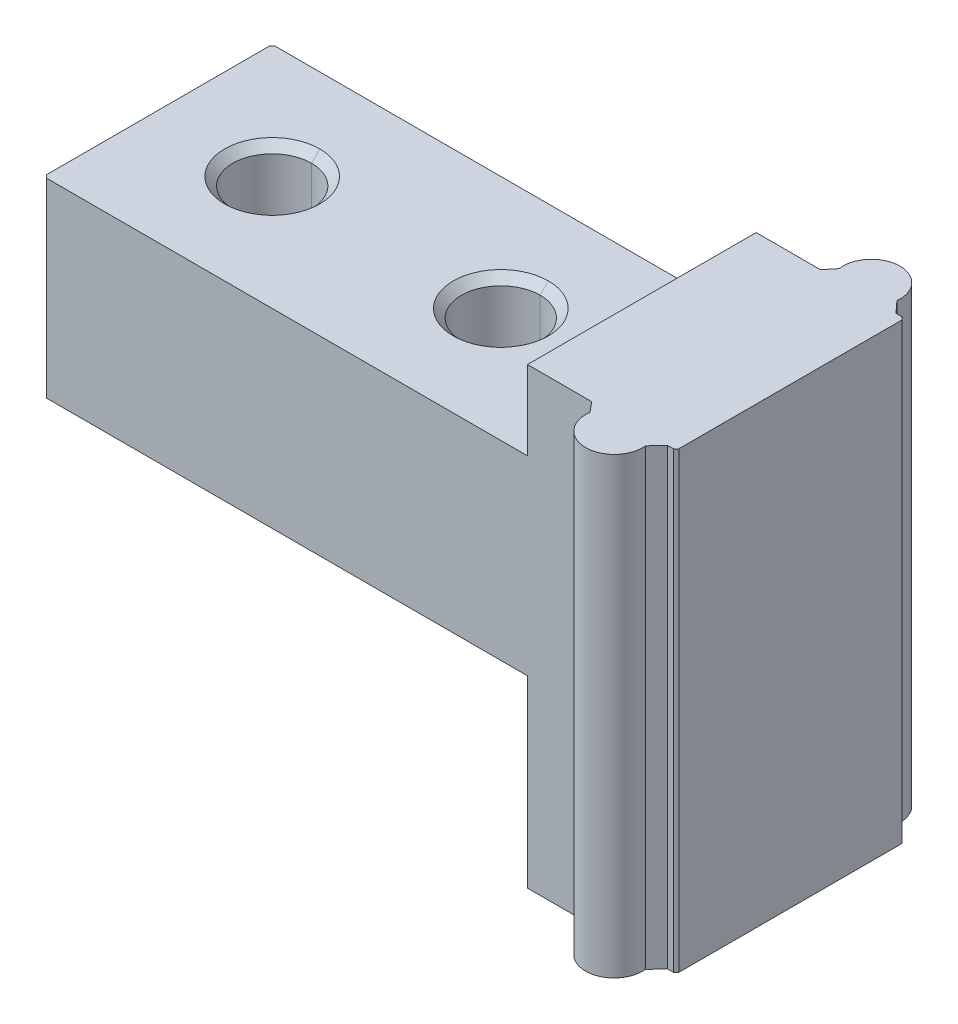
ISO-10303-21;
HEADER;
FILE_DESCRIPTION(('STEP AP214'),'2;1');
FILE_NAME('part.step','',(''),(''),'','','');
FILE_SCHEMA(('AUTOMOTIVE_DESIGN { 1 0 10303 214 1 1 1 1 }'));
ENDSEC;
DATA;
#1=APPLICATION_CONTEXT('core data for automotive mechanical design processes');
#2=APPLICATION_PROTOCOL_DEFINITION('international standard','automotive_design',2000,#1);
#3=PRODUCT_CONTEXT('',#1,'mechanical');
#4=PRODUCT('Part','Part','',(#3));
#5=PRODUCT_RELATED_PRODUCT_CATEGORY('part','',(#4));
#6=PRODUCT_DEFINITION_FORMATION('','',#4);
#7=PRODUCT_DEFINITION_CONTEXT('part definition',#1,'design');
#8=PRODUCT_DEFINITION('design','',#6,#7);
#9=PRODUCT_DEFINITION_SHAPE('','',#8);
#10=(LENGTH_UNIT() NAMED_UNIT(*) SI_UNIT(.MILLI.,.METRE.));
#11=(NAMED_UNIT(*) PLANE_ANGLE_UNIT() SI_UNIT($,.RADIAN.));
#12=(NAMED_UNIT(*) SI_UNIT($,.STERADIAN.) SOLID_ANGLE_UNIT());
#13=UNCERTAINTY_MEASURE_WITH_UNIT(LENGTH_MEASURE(1.E-05),#10,'distance_accuracy_value','');
#14=(GEOMETRIC_REPRESENTATION_CONTEXT(3) GLOBAL_UNCERTAINTY_ASSIGNED_CONTEXT((#13)) GLOBAL_UNIT_ASSIGNED_CONTEXT((#10,
#11,#12)) REPRESENTATION_CONTEXT('',''));
#15=CARTESIAN_POINT('',(0.,0.,0.));
#16=DIRECTION('',(0.,0.,1.));
#17=DIRECTION('',(1.,0.,0.));
#18=AXIS2_PLACEMENT_3D('',#15,#16,#17);
#19=CARTESIAN_POINT('',(-85.,26.217,0.));
#20=DIRECTION('',(0.,1.,0.));
#21=DIRECTION('',(0.,0.,1.));
#22=AXIS2_PLACEMENT_3D('',#19,#20,#21);
#23=CONICAL_SURFACE('',#22,2.067,0.785398163397469);
#24=DIRECTION('',(0.,0.707106781186533,-0.707106781186562));
#25=VECTOR('',#24,1.);
#26=CARTESIAN_POINT('',(-85.,26.217,-2.067));
#27=LINE('',#26,#25);
#28=CARTESIAN_POINT('',(-85.,26.217,-2.067));
#29=VERTEX_POINT('',#28);
#30=CARTESIAN_POINT('',(-85.,26.65,-2.5));
#31=VERTEX_POINT('',#30);
#32=EDGE_CURVE('E784',#29,#31,#27,.T.);
#33=ORIENTED_EDGE('',*,*,#32,.F.);
#34=CARTESIAN_POINT('',(-85.,26.217,0.));
#35=DIRECTION('',(0.,1.,0.));
#36=DIRECTION('',(0.,0.,1.));
#37=AXIS2_PLACEMENT_3D('',#34,#35,#36);
#38=CIRCLE('',#37,2.067);
#39=CARTESIAN_POINT('',(-85.,26.217,2.067));
#40=VERTEX_POINT('',#39);
#41=EDGE_CURVE('E11',#40,#29,#38,.T.);
#42=ORIENTED_EDGE('',*,*,#41,.F.);
#43=DIRECTION('',(0.,0.707106781186533,0.707106781186562));
#44=VECTOR('',#43,1.);
#45=CARTESIAN_POINT('',(-85.,26.217,2.067));
#46=LINE('',#45,#44);
#47=CARTESIAN_POINT('',(-85.,26.65,2.5));
#48=VERTEX_POINT('',#47);
#49=EDGE_CURVE('E793',#40,#48,#46,.T.);
#50=ORIENTED_EDGE('',*,*,#49,.T.);
#51=CARTESIAN_POINT('',(-85.,26.65,0.));
#52=DIRECTION('',(0.,1.,0.));
#53=DIRECTION('',(0.,0.,1.));
#54=AXIS2_PLACEMENT_3D('',#51,#52,#53);
#55=CIRCLE('',#54,2.5);
#56=EDGE_CURVE('E174',#48,#31,#55,.T.);
#57=ORIENTED_EDGE('',*,*,#56,.T.);
#58=EDGE_LOOP('',(#33,#42,#50,#57));
#59=FACE_BOUND('',#58,.T.);
#60=ADVANCED_FACE('F17',(#59),#23,.F.);
#61=CARTESIAN_POINT('',(-85.,26.65,0.));
#62=DIRECTION('',(0.,1.,0.));
#63=DIRECTION('',(0.,0.,1.));
#64=AXIS2_PLACEMENT_3D('',#61,#62,#63);
#65=CYLINDRICAL_SURFACE('',#64,2.067);
#66=DIRECTION('',(0.,1.,0.));
#67=VECTOR('',#66,1.);
#68=CARTESIAN_POINT('',(-85.,26.65,-2.067));
#69=LINE('',#68,#67);
#70=CARTESIAN_POINT('',(-85.,17.073,-2.067));
#71=VERTEX_POINT('',#70);
#72=EDGE_CURVE('E242',#71,#29,#69,.T.);
#73=ORIENTED_EDGE('',*,*,#72,.F.);
#74=CARTESIAN_POINT('',(-85.,17.073,0.));
#75=DIRECTION('',(0.,1.,0.));
#76=DIRECTION('',(0.,0.,1.));
#77=AXIS2_PLACEMENT_3D('',#74,#75,#76);
#78=CIRCLE('',#77,2.067);
#79=CARTESIAN_POINT('',(-85.,17.073,2.067));
#80=VERTEX_POINT('',#79);
#81=EDGE_CURVE('E27',#80,#71,#78,.T.);
#82=ORIENTED_EDGE('',*,*,#81,.F.);
#83=DIRECTION('',(0.,1.,0.));
#84=VECTOR('',#83,1.);
#85=CARTESIAN_POINT('',(-85.,26.65,2.067));
#86=LINE('',#85,#84);
#87=EDGE_CURVE('E237',#80,#40,#86,.T.);
#88=ORIENTED_EDGE('',*,*,#87,.T.);
#89=ORIENTED_EDGE('',*,*,#41,.T.);
#90=EDGE_LOOP('',(#73,#82,#88,#89));
#91=FACE_BOUND('',#90,.T.);
#92=ADVANCED_FACE('F822',(#91),#65,.F.);
#93=CARTESIAN_POINT('',(-85.,16.64,0.));
#94=DIRECTION('',(0.,-1.,0.));
#95=DIRECTION('',(0.,0.,-1.));
#96=AXIS2_PLACEMENT_3D('',#93,#94,#95);
#97=CONICAL_SURFACE('',#96,2.5,0.785398163397469);
#98=DIRECTION('',(0.,-0.707106781186533,0.707106781186562));
#99=VECTOR('',#98,1.);
#100=CARTESIAN_POINT('',(-85.,16.64,2.5));
#101=LINE('',#100,#99);
#102=CARTESIAN_POINT('',(-85.,16.65,2.49));
#103=VERTEX_POINT('',#102);
#104=EDGE_CURVE('E241',#80,#103,#101,.T.);
#105=ORIENTED_EDGE('',*,*,#104,.F.);
#106=ORIENTED_EDGE('',*,*,#81,.T.);
#107=DIRECTION('',(0.,-0.707106781186533,-0.707106781186562));
#108=VECTOR('',#107,1.);
#109=CARTESIAN_POINT('',(-85.,16.64,-2.5));
#110=LINE('',#109,#108);
#111=CARTESIAN_POINT('',(-85.,16.65,-2.49));
#112=VERTEX_POINT('',#111);
#113=EDGE_CURVE('E267',#71,#112,#110,.T.);
#114=ORIENTED_EDGE('',*,*,#113,.T.);
#115=CARTESIAN_POINT('',(-85.,16.65,0.));
#116=DIRECTION('',(0.,-1.,0.));
#117=DIRECTION('',(0.,0.,1.));
#118=AXIS2_PLACEMENT_3D('',#115,#116,#117);
#119=CIRCLE('',#118,2.49);
#120=EDGE_CURVE('E190',#112,#103,#119,.T.);
#121=ORIENTED_EDGE('',*,*,#120,.T.);
#122=EDGE_LOOP('',(#105,#106,#114,#121));
#123=FACE_BOUND('',#122,.T.);
#124=ADVANCED_FACE('F905',(#123),#97,.F.);
#125=CARTESIAN_POINT('',(-97.,26.217,0.));
#126=DIRECTION('',(0.,1.,0.));
#127=DIRECTION('',(0.,0.,1.));
#128=AXIS2_PLACEMENT_3D('',#125,#126,#127);
#129=CONICAL_SURFACE('',#128,2.067,0.785398163397469);
#130=DIRECTION('',(0.,0.707106781186533,-0.707106781186562));
#131=VECTOR('',#130,1.);
#132=CARTESIAN_POINT('',(-97.,26.217,-2.067));
#133=LINE('',#132,#131);
#134=CARTESIAN_POINT('',(-97.,26.217,-2.067));
#135=VERTEX_POINT('',#134);
#136=CARTESIAN_POINT('',(-97.,26.65,-2.5));
#137=VERTEX_POINT('',#136);
#138=EDGE_CURVE('E221',#135,#137,#133,.T.);
#139=ORIENTED_EDGE('',*,*,#138,.F.);
#140=CARTESIAN_POINT('',(-97.,26.217,0.));
#141=DIRECTION('',(0.,1.,0.));
#142=DIRECTION('',(0.,0.,1.));
#143=AXIS2_PLACEMENT_3D('',#140,#141,#142);
#144=CIRCLE('',#143,2.067);
#145=CARTESIAN_POINT('',(-97.,26.217,2.067));
#146=VERTEX_POINT('',#145);
#147=EDGE_CURVE('E20',#146,#135,#144,.T.);
#148=ORIENTED_EDGE('',*,*,#147,.F.);
#149=DIRECTION('',(0.,0.707106781186533,0.707106781186562));
#150=VECTOR('',#149,1.);
#151=CARTESIAN_POINT('',(-97.,26.217,2.067));
#152=LINE('',#151,#150);
#153=CARTESIAN_POINT('',(-97.,26.65,2.5));
#154=VERTEX_POINT('',#153);
#155=EDGE_CURVE('E220',#146,#154,#152,.T.);
#156=ORIENTED_EDGE('',*,*,#155,.T.);
#157=CARTESIAN_POINT('',(-97.,26.65,0.));
#158=DIRECTION('',(0.,1.,0.));
#159=DIRECTION('',(0.,0.,1.));
#160=AXIS2_PLACEMENT_3D('',#157,#158,#159);
#161=CIRCLE('',#160,2.5);
#162=EDGE_CURVE('E177',#154,#137,#161,.T.);
#163=ORIENTED_EDGE('',*,*,#162,.T.);
#164=EDGE_LOOP('',(#139,#148,#156,#163));
#165=FACE_BOUND('',#164,.T.);
#166=ADVANCED_FACE('F916',(#165),#129,.F.);
#167=CARTESIAN_POINT('',(-97.,26.65,0.));
#168=DIRECTION('',(0.,1.,0.));
#169=DIRECTION('',(0.,0.,1.));
#170=AXIS2_PLACEMENT_3D('',#167,#168,#169);
#171=CYLINDRICAL_SURFACE('',#170,2.067);
#172=DIRECTION('',(0.,1.,0.));
#173=VECTOR('',#172,1.);
#174=CARTESIAN_POINT('',(-97.,26.65,-2.067));
#175=LINE('',#174,#173);
#176=CARTESIAN_POINT('',(-97.,17.073,-2.067));
#177=VERTEX_POINT('',#176);
#178=EDGE_CURVE('E271',#177,#135,#175,.T.);
#179=ORIENTED_EDGE('',*,*,#178,.F.);
#180=CARTESIAN_POINT('',(-97.,17.073,0.));
#181=DIRECTION('',(0.,1.,0.));
#182=DIRECTION('',(0.,0.,1.));
#183=AXIS2_PLACEMENT_3D('',#180,#181,#182);
#184=CIRCLE('',#183,2.067);
#185=CARTESIAN_POINT('',(-97.,17.073,2.067));
#186=VERTEX_POINT('',#185);
#187=EDGE_CURVE('E357',#186,#177,#184,.T.);
#188=ORIENTED_EDGE('',*,*,#187,.F.);
#189=DIRECTION('',(0.,1.,0.));
#190=VECTOR('',#189,1.);
#191=CARTESIAN_POINT('',(-97.,26.65,2.067));
#192=LINE('',#191,#190);
#193=EDGE_CURVE('E275',#186,#146,#192,.T.);
#194=ORIENTED_EDGE('',*,*,#193,.T.);
#195=ORIENTED_EDGE('',*,*,#147,.T.);
#196=EDGE_LOOP('',(#179,#188,#194,#195));
#197=FACE_BOUND('',#196,.T.);
#198=ADVANCED_FACE('F852',(#197),#171,.F.);
#199=CARTESIAN_POINT('',(-97.,16.64,0.));
#200=DIRECTION('',(0.,-1.,0.));
#201=DIRECTION('',(0.,0.,-1.));
#202=AXIS2_PLACEMENT_3D('',#199,#200,#201);
#203=CONICAL_SURFACE('',#202,2.5,0.785398163397469);
#204=DIRECTION('',(0.,-0.707106781186533,0.707106781186562));
#205=VECTOR('',#204,1.);
#206=CARTESIAN_POINT('',(-97.,16.64,2.5));
#207=LINE('',#206,#205);
#208=CARTESIAN_POINT('',(-97.,16.65,2.49));
#209=VERTEX_POINT('',#208);
#210=EDGE_CURVE('E294',#186,#209,#207,.T.);
#211=ORIENTED_EDGE('',*,*,#210,.F.);
#212=ORIENTED_EDGE('',*,*,#187,.T.);
#213=DIRECTION('',(0.,-0.707106781186533,-0.707106781186562));
#214=VECTOR('',#213,1.);
#215=CARTESIAN_POINT('',(-97.,16.64,-2.5));
#216=LINE('',#215,#214);
#217=CARTESIAN_POINT('',(-97.,16.65,-2.49));
#218=VERTEX_POINT('',#217);
#219=EDGE_CURVE('E312',#177,#218,#216,.T.);
#220=ORIENTED_EDGE('',*,*,#219,.T.);
#221=CARTESIAN_POINT('',(-97.,16.65,0.));
#222=DIRECTION('',(0.,-1.,0.));
#223=DIRECTION('',(0.,0.,1.));
#224=AXIS2_PLACEMENT_3D('',#221,#222,#223);
#225=CIRCLE('',#224,2.49);
#226=EDGE_CURVE('E225',#218,#209,#225,.T.);
#227=ORIENTED_EDGE('',*,*,#226,.T.);
#228=EDGE_LOOP('',(#211,#212,#220,#227));
#229=FACE_BOUND('',#228,.T.);
#230=ADVANCED_FACE('F858',(#229),#203,.F.);
#231=CARTESIAN_POINT('',(-103.,26.65,5.8585786437627));
#232=DIRECTION('',(0.707106781179767,0.,-0.707106781193328));
#233=DIRECTION('',(0.,-1.,0.));
#234=AXIS2_PLACEMENT_3D('',#231,#232,#233);
#235=PLANE('',#234);
#236=DIRECTION('',(0.707106781193316,0.,0.70710678117978));
#237=VECTOR('',#236,1.);
#238=CARTESIAN_POINT('',(-103.,16.65,5.8585786437627));
#239=LINE('',#238,#237);
#240=CARTESIAN_POINT('',(-103.,16.65,5.8585786437627));
#241=VERTEX_POINT('',#240);
#242=CARTESIAN_POINT('',(-102.85857864376,16.65,6.));
#243=VERTEX_POINT('',#242);
#244=EDGE_CURVE('E182',#241,#243,#239,.T.);
#245=ORIENTED_EDGE('',*,*,#244,.T.);
#246=DIRECTION('',(0.,-1.,0.));
#247=VECTOR('',#246,1.);
#248=CARTESIAN_POINT('',(-102.85857864376,26.65,6.));
#249=LINE('',#248,#247);
#250=CARTESIAN_POINT('',(-102.85857864376,26.65,6.));
#251=VERTEX_POINT('',#250);
#252=EDGE_CURVE('E253',#251,#243,#249,.T.);
#253=ORIENTED_EDGE('',*,*,#252,.F.);
#254=DIRECTION('',(0.707106781193316,0.,0.70710678117978));
#255=VECTOR('',#254,1.);
#256=CARTESIAN_POINT('',(-103.,26.65,5.8585786437627));
#257=LINE('',#256,#255);
#258=CARTESIAN_POINT('',(-103.,26.65,5.8585786437627));
#259=VERTEX_POINT('',#258);
#260=EDGE_CURVE('E178',#259,#251,#257,.T.);
#261=ORIENTED_EDGE('',*,*,#260,.F.);
#262=DIRECTION('',(0.,-1.,0.));
#263=VECTOR('',#262,1.);
#264=CARTESIAN_POINT('',(-103.,26.65,5.8585786437627));
#265=LINE('',#264,#263);
#266=EDGE_CURVE('E224',#259,#241,#265,.T.);
#267=ORIENTED_EDGE('',*,*,#266,.T.);
#268=EDGE_LOOP('',(#245,#253,#261,#267));
#269=FACE_BOUND('',#268,.T.);
#270=ADVANCED_FACE('F772',(#269),#235,.F.);
#271=CARTESIAN_POINT('',(-103.,26.65,-5.8585786437627));
#272=DIRECTION('',(1.,0.,0.));
#273=DIRECTION('',(0.,1.,0.));
#274=AXIS2_PLACEMENT_3D('',#271,#272,#273);
#275=PLANE('',#274);
#276=DIRECTION('',(0.,0.,1.));
#277=VECTOR('',#276,1.);
#278=CARTESIAN_POINT('',(-103.,16.65,-5.8585786437627));
#279=LINE('',#278,#277);
#280=CARTESIAN_POINT('',(-103.,16.65,-5.8585786437627));
#281=VERTEX_POINT('',#280);
#282=EDGE_CURVE('E179',#281,#241,#279,.T.);
#283=ORIENTED_EDGE('',*,*,#282,.T.);
#284=ORIENTED_EDGE('',*,*,#266,.F.);
#285=DIRECTION('',(0.,0.,1.));
#286=VECTOR('',#285,1.);
#287=CARTESIAN_POINT('',(-103.,26.65,-5.8585786437627));
#288=LINE('',#287,#286);
#289=CARTESIAN_POINT('',(-103.,26.65,-5.8585786437627));
#290=VERTEX_POINT('',#289);
#291=EDGE_CURVE('E209',#290,#259,#288,.T.);
#292=ORIENTED_EDGE('',*,*,#291,.F.);
#293=DIRECTION('',(0.,-1.,0.));
#294=VECTOR('',#293,1.);
#295=CARTESIAN_POINT('',(-103.,26.65,-5.8585786437627));
#296=LINE('',#295,#294);
#297=EDGE_CURVE('E42',#290,#281,#296,.T.);
#298=ORIENTED_EDGE('',*,*,#297,.T.);
#299=EDGE_LOOP('',(#283,#284,#292,#298));
#300=FACE_BOUND('',#299,.T.);
#301=ADVANCED_FACE('F771',(#300),#275,.F.);
#302=CARTESIAN_POINT('',(-102.85857864376,26.65,-6.));
#303=DIRECTION('',(0.707106781179767,0.,0.707106781193328));
#304=DIRECTION('',(0.,-1.,0.));
#305=AXIS2_PLACEMENT_3D('',#302,#303,#304);
#306=PLANE('',#305);
#307=DIRECTION('',(-0.707106781193316,0.,0.70710678117978));
#308=VECTOR('',#307,1.);
#309=CARTESIAN_POINT('',(-102.85857864376,16.65,-6.));
#310=LINE('',#309,#308);
#311=CARTESIAN_POINT('',(-102.85857864376,16.65,-6.));
#312=VERTEX_POINT('',#311);
#313=EDGE_CURVE('E181',#312,#281,#310,.T.);
#314=ORIENTED_EDGE('',*,*,#313,.T.);
#315=ORIENTED_EDGE('',*,*,#297,.F.);
#316=DIRECTION('',(-0.707106781193316,0.,0.70710678117978));
#317=VECTOR('',#316,1.);
#318=CARTESIAN_POINT('',(-102.85857864376,26.65,-6.));
#319=LINE('',#318,#317);
#320=CARTESIAN_POINT('',(-102.85857864376,26.65,-6.));
#321=VERTEX_POINT('',#320);
#322=EDGE_CURVE('E173',#321,#290,#319,.T.);
#323=ORIENTED_EDGE('',*,*,#322,.F.);
#324=DIRECTION('',(0.,-1.,0.));
#325=VECTOR('',#324,1.);
#326=CARTESIAN_POINT('',(-102.85857864376,26.65,-6.));
#327=LINE('',#326,#325);
#328=EDGE_CURVE('E287',#321,#312,#327,.T.);
#329=ORIENTED_EDGE('',*,*,#328,.T.);
#330=EDGE_LOOP('',(#314,#315,#323,#329));
#331=FACE_BOUND('',#330,.T.);
#332=ADVANCED_FACE('F872',(#331),#306,.F.);
#333=CARTESIAN_POINT('',(0.,16.65,0.));
#334=DIRECTION('',(0.,1.,0.));
#335=DIRECTION('',(1.,0.,0.));
#336=AXIS2_PLACEMENT_3D('',#333,#334,#335);
#337=PLANE('',#336);
#338=ORIENTED_EDGE('',*,*,#226,.F.);
#339=CARTESIAN_POINT('',(-97.,16.65,0.));
#340=DIRECTION('',(0.,-1.,0.));
#341=DIRECTION('',(0.,0.,1.));
#342=AXIS2_PLACEMENT_3D('',#339,#340,#341);
#343=CIRCLE('',#342,2.49);
#344=EDGE_CURVE('E301',#209,#218,#343,.T.);
#345=ORIENTED_EDGE('',*,*,#344,.F.);
#346=EDGE_LOOP('',(#338,#345));
#347=FACE_BOUND('',#346,.T.);
#348=ORIENTED_EDGE('',*,*,#120,.F.);
#349=CARTESIAN_POINT('',(-85.,16.65,0.));
#350=DIRECTION('',(0.,-1.,0.));
#351=DIRECTION('',(0.,0.,1.));
#352=AXIS2_PLACEMENT_3D('',#349,#350,#351);
#353=CIRCLE('',#352,2.49);
#354=EDGE_CURVE('E252',#103,#112,#353,.T.);
#355=ORIENTED_EDGE('',*,*,#354,.F.);
#356=EDGE_LOOP('',(#348,#355));
#357=FACE_BOUND('',#356,.T.);
#358=DIRECTION('',(-1.,0.,0.));
#359=VECTOR('',#358,1.);
#360=CARTESIAN_POINT('',(-77.6,16.65,-6.));
#361=LINE('',#360,#359);
#362=CARTESIAN_POINT('',(-77.6,16.65,-6.));
#363=VERTEX_POINT('',#362);
#364=EDGE_CURVE('E283',#363,#312,#361,.T.);
#365=ORIENTED_EDGE('',*,*,#364,.F.);
#366=DIRECTION('',(0.,0.,1.));
#367=VECTOR('',#366,1.);
#368=CARTESIAN_POINT('',(-77.6,16.65,-6.));
#369=LINE('',#368,#367);
#370=CARTESIAN_POINT('',(-77.6,16.65,6.));
#371=VERTEX_POINT('',#370);
#372=EDGE_CURVE('E327',#363,#371,#369,.T.);
#373=ORIENTED_EDGE('',*,*,#372,.T.);
#374=DIRECTION('',(1.,0.,0.));
#375=VECTOR('',#374,1.);
#376=CARTESIAN_POINT('',(-102.85857864376,16.65,6.));
#377=LINE('',#376,#375);
#378=EDGE_CURVE('E257',#243,#371,#377,.T.);
#379=ORIENTED_EDGE('',*,*,#378,.F.);
#380=ORIENTED_EDGE('',*,*,#244,.F.);
#381=ORIENTED_EDGE('',*,*,#282,.F.);
#382=ORIENTED_EDGE('',*,*,#313,.F.);
#383=EDGE_LOOP('',(#365,#373,#379,#380,#381,#382));
#384=FACE_BOUND('',#383,.T.);
#385=ADVANCED_FACE('F869',(#347,#357,#384),#337,.F.);
#386=CARTESIAN_POINT('',(0.,26.65,0.));
#387=DIRECTION('',(0.,1.,0.));
#388=DIRECTION('',(1.,0.,0.));
#389=AXIS2_PLACEMENT_3D('',#386,#387,#388);
#390=PLANE('',#389);
#391=ORIENTED_EDGE('',*,*,#162,.F.);
#392=CARTESIAN_POINT('',(-97.,26.65,0.));
#393=DIRECTION('',(0.,1.,0.));
#394=DIRECTION('',(0.,0.,1.));
#395=AXIS2_PLACEMENT_3D('',#392,#393,#394);
#396=CIRCLE('',#395,2.5);
#397=EDGE_CURVE('E216',#137,#154,#396,.T.);
#398=ORIENTED_EDGE('',*,*,#397,.F.);
#399=EDGE_LOOP('',(#391,#398));
#400=FACE_BOUND('',#399,.T.);
#401=ORIENTED_EDGE('',*,*,#56,.F.);
#402=CARTESIAN_POINT('',(-85.,26.65,0.));
#403=DIRECTION('',(0.,1.,0.));
#404=DIRECTION('',(0.,0.,1.));
#405=AXIS2_PLACEMENT_3D('',#402,#403,#404);
#406=CIRCLE('',#405,2.5);
#407=EDGE_CURVE('E788',#31,#48,#406,.T.);
#408=ORIENTED_EDGE('',*,*,#407,.F.);
#409=EDGE_LOOP('',(#401,#408));
#410=FACE_BOUND('',#409,.T.);
#411=DIRECTION('',(0.,0.,1.));
#412=VECTOR('',#411,1.);
#413=CARTESIAN_POINT('',(-77.6,26.65,-6.));
#414=LINE('',#413,#412);
#415=CARTESIAN_POINT('',(-77.6,26.65,-6.));
#416=VERTEX_POINT('',#415);
#417=CARTESIAN_POINT('',(-77.6,26.65,6.));
#418=VERTEX_POINT('',#417);
#419=EDGE_CURVE('E367',#416,#418,#414,.T.);
#420=ORIENTED_EDGE('',*,*,#419,.F.);
#421=DIRECTION('',(-1.,0.,0.));
#422=VECTOR('',#421,1.);
#423=CARTESIAN_POINT('',(-77.6,26.65,-6.));
#424=LINE('',#423,#422);
#425=EDGE_CURVE('E215',#416,#321,#424,.T.);
#426=ORIENTED_EDGE('',*,*,#425,.T.);
#427=ORIENTED_EDGE('',*,*,#322,.T.);
#428=ORIENTED_EDGE('',*,*,#291,.T.);
#429=ORIENTED_EDGE('',*,*,#260,.T.);
#430=DIRECTION('',(1.,0.,0.));
#431=VECTOR('',#430,1.);
#432=CARTESIAN_POINT('',(-102.85857864376,26.65,6.));
#433=LINE('',#432,#431);
#434=EDGE_CURVE('E258',#251,#418,#433,.T.);
#435=ORIENTED_EDGE('',*,*,#434,.T.);
#436=EDGE_LOOP('',(#420,#426,#427,#428,#429,#435));
#437=FACE_BOUND('',#436,.T.);
#438=ADVANCED_FACE('F774',(#400,#410,#437),#390,.T.);
#439=CARTESIAN_POINT('',(-72.3,7.,6.75000000000036));
#440=DIRECTION('',(0.,1.,0.));
#441=DIRECTION('',(1.,0.,0.));
#442=AXIS2_PLACEMENT_3D('',#439,#440,#441);
#443=PLANE('',#442);
#444=DIRECTION('',(-1.,0.,0.));
#445=VECTOR('',#444,1.);
#446=CARTESIAN_POINT('',(-74.23,7.,-6.));
#447=LINE('',#446,#445);
#448=CARTESIAN_POINT('',(-74.23,7.,-6.));
#449=VERTEX_POINT('',#448);
#450=CARTESIAN_POINT('',(-77.6,7.,-6.));
#451=VERTEX_POINT('',#450);
#452=EDGE_CURVE('E263',#449,#451,#447,.T.);
#453=ORIENTED_EDGE('',*,*,#452,.F.);
#454=DIRECTION('',(-0.641255632677549,0.,0.767327318397643));
#455=VECTOR('',#454,1.);
#456=CARTESIAN_POINT('',(-73.784272911208,7.,-6.5333576102121));
#457=LINE('',#456,#455);
#458=CARTESIAN_POINT('',(-73.784272911208,7.,-6.5333576102121));
#459=VERTEX_POINT('',#458);
#460=EDGE_CURVE('E138',#459,#449,#457,.T.);
#461=ORIENTED_EDGE('',*,*,#460,.F.);
#462=CARTESIAN_POINT('',(-72.3,7.,-6.75000000000036));
#463=DIRECTION('',(0.,1.,0.));
#464=DIRECTION('',(0.994936566731635,0.,0.100504866450671));
#465=AXIS2_PLACEMENT_3D('',#462,#463,#464);
#466=CIRCLE('',#465,1.49999999999962);
#467=CARTESIAN_POINT('',(-72.3,7.,-8.25));
#468=VERTEX_POINT('',#467);
#469=EDGE_CURVE('E133',#468,#459,#466,.T.);
#470=ORIENTED_EDGE('',*,*,#469,.F.);
#471=CARTESIAN_POINT('',(-72.3,7.,-6.75000000000036));
#472=DIRECTION('',(0.,1.,0.));
#473=DIRECTION('',(0.994936566731635,0.,0.100504866450671));
#474=AXIS2_PLACEMENT_3D('',#471,#472,#473);
#475=CIRCLE('',#474,1.49999999999962);
#476=CARTESIAN_POINT('',(-70.807595149903,7.,-6.5992427003244));
#477=VERTEX_POINT('',#476);
#478=EDGE_CURVE('E122',#477,#468,#475,.T.);
#479=ORIENTED_EDGE('',*,*,#478,.F.);
#480=DIRECTION('',(-0.674578687870797,0.,-0.7382029489717));
#481=VECTOR('',#480,1.);
#482=CARTESIAN_POINT('',(-70.26,7.,-6.));
#483=LINE('',#482,#481);
#484=CARTESIAN_POINT('',(-70.26,7.,-6.));
#485=VERTEX_POINT('',#484);
#486=EDGE_CURVE('E128',#485,#477,#483,.T.);
#487=ORIENTED_EDGE('',*,*,#486,.F.);
#488=DIRECTION('',(-1.,0.,0.));
#489=VECTOR('',#488,1.);
#490=CARTESIAN_POINT('',(-69.941421356237,7.,-6.));
#491=LINE('',#490,#489);
#492=CARTESIAN_POINT('',(-69.941421356237,7.,-6.));
#493=VERTEX_POINT('',#492);
#494=EDGE_CURVE('E164',#493,#485,#491,.T.);
#495=ORIENTED_EDGE('',*,*,#494,.F.);
#496=DIRECTION('',(-0.707106781185801,0.,-0.707106781187294));
#497=VECTOR('',#496,1.);
#498=CARTESIAN_POINT('',(-69.8,7.,-5.8585786437627));
#499=LINE('',#498,#497);
#500=CARTESIAN_POINT('',(-69.8,7.,-5.8585786437627));
#501=VERTEX_POINT('',#500);
#502=EDGE_CURVE('E417',#501,#493,#499,.T.);
#503=ORIENTED_EDGE('',*,*,#502,.F.);
#504=DIRECTION('',(0.,0.,-1.));
#505=VECTOR('',#504,1.);
#506=CARTESIAN_POINT('',(-69.8,7.,5.8585786437627));
#507=LINE('',#506,#505);
#508=CARTESIAN_POINT('',(-69.8,7.,5.8585786437627));
#509=VERTEX_POINT('',#508);
#510=EDGE_CURVE('E307',#509,#501,#507,.T.);
#511=ORIENTED_EDGE('',*,*,#510,.F.);
#512=DIRECTION('',(0.707106781185801,0.,-0.707106781187294));
#513=VECTOR('',#512,1.);
#514=CARTESIAN_POINT('',(-69.941421356237,7.,6.));
#515=LINE('',#514,#513);
#516=CARTESIAN_POINT('',(-69.941421356237,7.,6.));
#517=VERTEX_POINT('',#516);
#518=EDGE_CURVE('E247',#517,#509,#515,.T.);
#519=ORIENTED_EDGE('',*,*,#518,.F.);
#520=DIRECTION('',(1.,0.,0.));
#521=VECTOR('',#520,1.);
#522=CARTESIAN_POINT('',(-70.26,7.,6.));
#523=LINE('',#522,#521);
#524=CARTESIAN_POINT('',(-70.26,7.,6.));
#525=VERTEX_POINT('',#524);
#526=EDGE_CURVE('E444',#525,#517,#523,.T.);
#527=ORIENTED_EDGE('',*,*,#526,.F.);
#528=DIRECTION('',(0.674578687870797,0.,-0.7382029489717));
#529=VECTOR('',#528,1.);
#530=CARTESIAN_POINT('',(-70.807595149903,7.,6.5992427003244));
#531=LINE('',#530,#529);
#532=CARTESIAN_POINT('',(-70.807595149903,7.,6.5992427003244));
#533=VERTEX_POINT('',#532);
#534=EDGE_CURVE('E395',#533,#525,#531,.T.);
#535=ORIENTED_EDGE('',*,*,#534,.F.);
#536=CARTESIAN_POINT('',(-72.3,7.,6.75000000000036));
#537=DIRECTION('',(0.,1.,0.));
#538=DIRECTION('',(-0.989515274138878,0.,-0.144428259858871));
#539=AXIS2_PLACEMENT_3D('',#536,#537,#538);
#540=CIRCLE('',#539,1.49999999999962);
#541=CARTESIAN_POINT('',(-73.784272911208,7.,6.5333576102121));
#542=VERTEX_POINT('',#541);
#543=EDGE_CURVE('E421',#542,#533,#540,.T.);
#544=ORIENTED_EDGE('',*,*,#543,.F.);
#545=DIRECTION('',(0.641255632677549,0.,0.767327318397643));
#546=VECTOR('',#545,1.);
#547=CARTESIAN_POINT('',(-74.23,7.,6.));
#548=LINE('',#547,#546);
#549=CARTESIAN_POINT('',(-74.23,7.,6.));
#550=VERTEX_POINT('',#549);
#551=EDGE_CURVE('E399',#550,#542,#548,.T.);
#552=ORIENTED_EDGE('',*,*,#551,.F.);
#553=DIRECTION('',(1.,0.,0.));
#554=VECTOR('',#553,1.);
#555=CARTESIAN_POINT('',(-77.6,7.,6.));
#556=LINE('',#555,#554);
#557=CARTESIAN_POINT('',(-77.6,7.,6.));
#558=VERTEX_POINT('',#557);
#559=EDGE_CURVE('E381',#558,#550,#556,.T.);
#560=ORIENTED_EDGE('',*,*,#559,.F.);
#561=DIRECTION('',(0.,0.,1.));
#562=VECTOR('',#561,1.);
#563=CARTESIAN_POINT('',(-77.6,7.,-6.));
#564=LINE('',#563,#562);
#565=EDGE_CURVE('E326',#451,#558,#564,.T.);
#566=ORIENTED_EDGE('',*,*,#565,.F.);
#567=EDGE_LOOP('',(#453,#461,#470,#479,#487,#495,#503,#511,#519,#527,#535,#544,#552,#560,#566));
#568=FACE_BOUND('',#567,.T.);
#569=ADVANCED_FACE('F125',(#568),#443,.F.);
#570=CARTESIAN_POINT('',(-72.3,30.8,6.75000000000036));
#571=DIRECTION('',(0.,1.,0.));
#572=DIRECTION('',(1.,0.,0.));
#573=AXIS2_PLACEMENT_3D('',#570,#571,#572);
#574=PLANE('',#573);
#575=DIRECTION('',(-1.,0.,0.));
#576=VECTOR('',#575,1.);
#577=CARTESIAN_POINT('',(-74.23,30.8,-6.));
#578=LINE('',#577,#576);
#579=CARTESIAN_POINT('',(-74.23,30.8,-6.));
#580=VERTEX_POINT('',#579);
#581=CARTESIAN_POINT('',(-77.6,30.8,-6.));
#582=VERTEX_POINT('',#581);
#583=EDGE_CURVE('E214',#580,#582,#578,.T.);
#584=ORIENTED_EDGE('',*,*,#583,.T.);
#585=DIRECTION('',(0.,0.,1.));
#586=VECTOR('',#585,1.);
#587=CARTESIAN_POINT('',(-77.6,30.8,-6.));
#588=LINE('',#587,#586);
#589=CARTESIAN_POINT('',(-77.6,30.8,6.));
#590=VERTEX_POINT('',#589);
#591=EDGE_CURVE('E298',#582,#590,#588,.T.);
#592=ORIENTED_EDGE('',*,*,#591,.T.);
#593=DIRECTION('',(1.,0.,0.));
#594=VECTOR('',#593,1.);
#595=CARTESIAN_POINT('',(-77.6,30.8,6.));
#596=LINE('',#595,#594);
#597=CARTESIAN_POINT('',(-74.23,30.8,6.));
#598=VERTEX_POINT('',#597);
#599=EDGE_CURVE('E389',#590,#598,#596,.T.);
#600=ORIENTED_EDGE('',*,*,#599,.T.);
#601=DIRECTION('',(0.641255632677549,0.,0.767327318397643));
#602=VECTOR('',#601,1.);
#603=CARTESIAN_POINT('',(-74.23,30.8,6.));
#604=LINE('',#603,#602);
#605=CARTESIAN_POINT('',(-73.784272911208,30.8,6.5333576102121));
#606=VERTEX_POINT('',#605);
#607=EDGE_CURVE('E411',#598,#606,#604,.T.);
#608=ORIENTED_EDGE('',*,*,#607,.T.);
#609=CARTESIAN_POINT('',(-72.3,30.8,6.75000000000036));
#610=DIRECTION('',(0.,1.,0.));
#611=DIRECTION('',(-0.989515274138878,0.,-0.144428259858871));
#612=AXIS2_PLACEMENT_3D('',#609,#610,#611);
#613=CIRCLE('',#612,1.49999999999962);
#614=CARTESIAN_POINT('',(-70.807595149903,30.8,6.5992427003244));
#615=VERTEX_POINT('',#614);
#616=EDGE_CURVE('E429',#606,#615,#613,.T.);
#617=ORIENTED_EDGE('',*,*,#616,.T.);
#618=DIRECTION('',(0.674578687870797,0.,-0.7382029489717));
#619=VECTOR('',#618,1.);
#620=CARTESIAN_POINT('',(-70.807595149903,30.8,6.5992427003244));
#621=LINE('',#620,#619);
#622=CARTESIAN_POINT('',(-70.26,30.8,6.));
#623=VERTEX_POINT('',#622);
#624=EDGE_CURVE('E394',#615,#623,#621,.T.);
#625=ORIENTED_EDGE('',*,*,#624,.T.);
#626=DIRECTION('',(1.,0.,0.));
#627=VECTOR('',#626,1.);
#628=CARTESIAN_POINT('',(-70.26,30.8,6.));
#629=LINE('',#628,#627);
#630=CARTESIAN_POINT('',(-69.941421356237,30.8,6.));
#631=VERTEX_POINT('',#630);
#632=EDGE_CURVE('E243',#623,#631,#629,.T.);
#633=ORIENTED_EDGE('',*,*,#632,.T.);
#634=DIRECTION('',(0.707106781185801,0.,-0.707106781187294));
#635=VECTOR('',#634,1.);
#636=CARTESIAN_POINT('',(-69.941421356237,30.8,6.));
#637=LINE('',#636,#635);
#638=CARTESIAN_POINT('',(-69.8,30.8,5.8585786437627));
#639=VERTEX_POINT('',#638);
#640=EDGE_CURVE('E303',#631,#639,#637,.T.);
#641=ORIENTED_EDGE('',*,*,#640,.T.);
#642=DIRECTION('',(0.,0.,-1.));
#643=VECTOR('',#642,1.);
#644=CARTESIAN_POINT('',(-69.8,30.8,5.8585786437627));
#645=LINE('',#644,#643);
#646=CARTESIAN_POINT('',(-69.8,30.8,-5.8585786437627));
#647=VERTEX_POINT('',#646);
#648=EDGE_CURVE('E460',#639,#647,#645,.T.);
#649=ORIENTED_EDGE('',*,*,#648,.T.);
#650=DIRECTION('',(-0.707106781185801,0.,-0.707106781187294));
#651=VECTOR('',#650,1.);
#652=CARTESIAN_POINT('',(-69.8,30.8,-5.8585786437627));
#653=LINE('',#652,#651);
#654=CARTESIAN_POINT('',(-69.941421356237,30.8,-6.));
#655=VERTEX_POINT('',#654);
#656=EDGE_CURVE('E416',#647,#655,#653,.T.);
#657=ORIENTED_EDGE('',*,*,#656,.T.);
#658=DIRECTION('',(-1.,0.,0.));
#659=VECTOR('',#658,1.);
#660=CARTESIAN_POINT('',(-69.941421356237,30.8,-6.));
#661=LINE('',#660,#659);
#662=CARTESIAN_POINT('',(-70.26,30.8,-6.));
#663=VERTEX_POINT('',#662);
#664=EDGE_CURVE('E155',#655,#663,#661,.T.);
#665=ORIENTED_EDGE('',*,*,#664,.T.);
#666=DIRECTION('',(-0.674578687870797,0.,-0.7382029489717));
#667=VECTOR('',#666,1.);
#668=CARTESIAN_POINT('',(-70.26,30.8,-6.));
#669=LINE('',#668,#667);
#670=CARTESIAN_POINT('',(-70.807595149903,30.8,-6.5992427003244));
#671=VERTEX_POINT('',#670);
#672=EDGE_CURVE('E148',#663,#671,#669,.T.);
#673=ORIENTED_EDGE('',*,*,#672,.T.);
#674=CARTESIAN_POINT('',(-72.3,30.8,-6.75000000000036));
#675=DIRECTION('',(0.,1.,0.));
#676=DIRECTION('',(0.994936566731635,0.,0.100504866450671));
#677=AXIS2_PLACEMENT_3D('',#674,#675,#676);
#678=CIRCLE('',#677,1.49999999999962);
#679=CARTESIAN_POINT('',(-72.3,30.8,-8.25));
#680=VERTEX_POINT('',#679);
#681=EDGE_CURVE('E139',#671,#680,#678,.T.);
#682=ORIENTED_EDGE('',*,*,#681,.T.);
#683=CARTESIAN_POINT('',(-72.3,30.8,-6.75000000000036));
#684=DIRECTION('',(0.,1.,0.));
#685=DIRECTION('',(0.994936566731635,0.,0.100504866450671));
#686=AXIS2_PLACEMENT_3D('',#683,#684,#685);
#687=CIRCLE('',#686,1.49999999999962);
#688=CARTESIAN_POINT('',(-73.784272911208,30.8,-6.5333576102121));
#689=VERTEX_POINT('',#688);
#690=EDGE_CURVE('E232',#680,#689,#687,.T.);
#691=ORIENTED_EDGE('',*,*,#690,.T.);
#692=DIRECTION('',(-0.641255632677549,0.,0.767327318397643));
#693=VECTOR('',#692,1.);
#694=CARTESIAN_POINT('',(-73.784272911208,30.8,-6.5333576102121));
#695=LINE('',#694,#693);
#696=EDGE_CURVE('E169',#689,#580,#695,.T.);
#697=ORIENTED_EDGE('',*,*,#696,.T.);
#698=EDGE_LOOP('',(#584,#592,#600,#608,#617,#625,#633,#641,#649,#657,#665,#673,#682,#691,#697));
#699=FACE_BOUND('',#698,.T.);
#700=ADVANCED_FACE('F887',(#699),#574,.T.);
#701=CARTESIAN_POINT('',(-73.784272911208,30.8,-6.5333576102121));
#702=DIRECTION('',(0.767327318397639,0.,0.641255632677552));
#703=DIRECTION('',(0.,-1.,0.));
#704=AXIS2_PLACEMENT_3D('',#701,#702,#703);
#705=PLANE('',#704);
#706=ORIENTED_EDGE('',*,*,#460,.T.);
#707=DIRECTION('',(0.,-1.,0.));
#708=VECTOR('',#707,1.);
#709=CARTESIAN_POINT('',(-74.23,30.8,-6.));
#710=LINE('',#709,#708);
#711=EDGE_CURVE('E259',#580,#449,#710,.T.);
#712=ORIENTED_EDGE('',*,*,#711,.F.);
#713=ORIENTED_EDGE('',*,*,#696,.F.);
#714=DIRECTION('',(0.,-1.,0.));
#715=VECTOR('',#714,1.);
#716=CARTESIAN_POINT('',(-73.784272911208,30.8,-6.5333576102121));
#717=LINE('',#716,#715);
#718=EDGE_CURVE('E330',#689,#459,#717,.T.);
#719=ORIENTED_EDGE('',*,*,#718,.T.);
#720=EDGE_LOOP('',(#706,#712,#713,#719));
#721=FACE_BOUND('',#720,.T.);
#722=ADVANCED_FACE('F985',(#721),#705,.F.);
#723=CARTESIAN_POINT('',(-72.3,30.8,-6.75000000000036));
#724=DIRECTION('',(0.,-1.,0.));
#725=DIRECTION('',(0.,0.,-1.));
#726=AXIS2_PLACEMENT_3D('',#723,#724,#725);
#727=CYLINDRICAL_SURFACE('',#726,1.49999999999962);
#728=DIRECTION('',(0.,-1.,0.));
#729=VECTOR('',#728,1.);
#730=CARTESIAN_POINT('',(-72.3,30.8,-8.25));
#731=LINE('',#730,#729);
#732=EDGE_CURVE('E229',#680,#468,#731,.T.);
#733=ORIENTED_EDGE('',*,*,#732,.F.);
#734=ORIENTED_EDGE('',*,*,#681,.F.);
#735=DIRECTION('',(0.,-1.,0.));
#736=VECTOR('',#735,1.);
#737=CARTESIAN_POINT('',(-70.807595149903,30.8,-6.5992427003244));
#738=LINE('',#737,#736);
#739=EDGE_CURVE('E142',#671,#477,#738,.T.);
#740=ORIENTED_EDGE('',*,*,#739,.T.);
#741=ORIENTED_EDGE('',*,*,#478,.T.);
#742=EDGE_LOOP('',(#733,#734,#740,#741));
#743=FACE_BOUND('',#742,.T.);
#744=ADVANCED_FACE('F143',(#743),#727,.T.);
#745=CARTESIAN_POINT('',(-70.26,30.8,-6.));
#746=DIRECTION('',(-0.738202948971699,0.,0.674578687870798));
#747=DIRECTION('',(0.,1.,0.));
#748=AXIS2_PLACEMENT_3D('',#745,#746,#747);
#749=PLANE('',#748);
#750=ORIENTED_EDGE('',*,*,#486,.T.);
#751=ORIENTED_EDGE('',*,*,#739,.F.);
#752=ORIENTED_EDGE('',*,*,#672,.F.);
#753=DIRECTION('',(0.,-1.,0.));
#754=VECTOR('',#753,1.);
#755=CARTESIAN_POINT('',(-70.26,30.8,-6.));
#756=LINE('',#755,#754);
#757=EDGE_CURVE('E152',#663,#485,#756,.T.);
#758=ORIENTED_EDGE('',*,*,#757,.T.);
#759=EDGE_LOOP('',(#750,#751,#752,#758));
#760=FACE_BOUND('',#759,.T.);
#761=ADVANCED_FACE('F150',(#760),#749,.F.);
#762=CARTESIAN_POINT('',(-69.941421356237,30.8,-6.));
#763=DIRECTION('',(0.,0.,1.));
#764=DIRECTION('',(1.,0.,0.));
#765=AXIS2_PLACEMENT_3D('',#762,#763,#764);
#766=PLANE('',#765);
#767=ORIENTED_EDGE('',*,*,#494,.T.);
#768=ORIENTED_EDGE('',*,*,#757,.F.);
#769=ORIENTED_EDGE('',*,*,#664,.F.);
#770=DIRECTION('',(0.,-1.,0.));
#771=VECTOR('',#770,1.);
#772=CARTESIAN_POINT('',(-69.941421356237,30.8,-6.));
#773=LINE('',#772,#771);
#774=EDGE_CURVE('E412',#655,#493,#773,.T.);
#775=ORIENTED_EDGE('',*,*,#774,.T.);
#776=EDGE_LOOP('',(#767,#768,#769,#775));
#777=FACE_BOUND('',#776,.T.);
#778=ADVANCED_FACE('F476',(#777),#766,.F.);
#779=CARTESIAN_POINT('',(-69.8,30.8,-5.8585786437627));
#780=DIRECTION('',(-0.707106781187296,0.,0.7071067811858));
#781=DIRECTION('',(0.,1.,0.));
#782=AXIS2_PLACEMENT_3D('',#779,#780,#781);
#783=PLANE('',#782);
#784=ORIENTED_EDGE('',*,*,#502,.T.);
#785=ORIENTED_EDGE('',*,*,#774,.F.);
#786=ORIENTED_EDGE('',*,*,#656,.F.);
#787=DIRECTION('',(0.,-1.,0.));
#788=VECTOR('',#787,1.);
#789=CARTESIAN_POINT('',(-69.8,30.8,-5.8585786437627));
#790=LINE('',#789,#788);
#791=EDGE_CURVE('E403',#647,#501,#790,.T.);
#792=ORIENTED_EDGE('',*,*,#791,.T.);
#793=EDGE_LOOP('',(#784,#785,#786,#792));
#794=FACE_BOUND('',#793,.T.);
#795=ADVANCED_FACE('F1022',(#794),#783,.F.);
#796=CARTESIAN_POINT('',(-69.8,30.8,5.8585786437627));
#797=DIRECTION('',(-1.,0.,0.));
#798=DIRECTION('',(0.,0.,1.));
#799=AXIS2_PLACEMENT_3D('',#796,#797,#798);
#800=PLANE('',#799);
#801=ORIENTED_EDGE('',*,*,#510,.T.);
#802=ORIENTED_EDGE('',*,*,#791,.F.);
#803=ORIENTED_EDGE('',*,*,#648,.F.);
#804=DIRECTION('',(0.,-1.,0.));
#805=VECTOR('',#804,1.);
#806=CARTESIAN_POINT('',(-69.8,30.8,5.8585786437627));
#807=LINE('',#806,#805);
#808=EDGE_CURVE('E308',#639,#509,#807,.T.);
#809=ORIENTED_EDGE('',*,*,#808,.T.);
#810=EDGE_LOOP('',(#801,#802,#803,#809));
#811=FACE_BOUND('',#810,.T.);
#812=ADVANCED_FACE('F1032',(#811),#800,.F.);
#813=CARTESIAN_POINT('',(-69.941421356237,30.8,6.));
#814=DIRECTION('',(-0.707106781187296,0.,-0.7071067811858));
#815=DIRECTION('',(-0.7071067811858,0.,0.707106781187296));
#816=AXIS2_PLACEMENT_3D('',#813,#814,#815);
#817=PLANE('',#816);
#818=ORIENTED_EDGE('',*,*,#518,.T.);
#819=ORIENTED_EDGE('',*,*,#808,.F.);
#820=ORIENTED_EDGE('',*,*,#640,.F.);
#821=DIRECTION('',(0.,-1.,0.));
#822=VECTOR('',#821,1.);
#823=CARTESIAN_POINT('',(-69.941421356237,30.8,6.));
#824=LINE('',#823,#822);
#825=EDGE_CURVE('E248',#631,#517,#824,.T.);
#826=ORIENTED_EDGE('',*,*,#825,.T.);
#827=EDGE_LOOP('',(#818,#819,#820,#826));
#828=FACE_BOUND('',#827,.T.);
#829=ADVANCED_FACE('F1043',(#828),#817,.F.);
#830=CARTESIAN_POINT('',(-70.26,30.8,6.));
#831=DIRECTION('',(0.,0.,-1.));
#832=DIRECTION('',(0.,-1.,0.));
#833=AXIS2_PLACEMENT_3D('',#830,#831,#832);
#834=PLANE('',#833);
#835=ORIENTED_EDGE('',*,*,#526,.T.);
#836=ORIENTED_EDGE('',*,*,#825,.F.);
#837=ORIENTED_EDGE('',*,*,#632,.F.);
#838=DIRECTION('',(0.,-1.,0.));
#839=VECTOR('',#838,1.);
#840=CARTESIAN_POINT('',(-70.26,30.8,6.));
#841=LINE('',#840,#839);
#842=EDGE_CURVE('E390',#623,#525,#841,.T.);
#843=ORIENTED_EDGE('',*,*,#842,.T.);
#844=EDGE_LOOP('',(#835,#836,#837,#843));
#845=FACE_BOUND('',#844,.T.);
#846=ADVANCED_FACE('F1054',(#845),#834,.F.);
#847=CARTESIAN_POINT('',(-70.807595149903,30.8,6.5992427003244));
#848=DIRECTION('',(-0.738202948971699,0.,-0.674578687870798));
#849=DIRECTION('',(-0.674578687870798,0.,0.738202948971699));
#850=AXIS2_PLACEMENT_3D('',#847,#848,#849);
#851=PLANE('',#850);
#852=ORIENTED_EDGE('',*,*,#534,.T.);
#853=ORIENTED_EDGE('',*,*,#842,.F.);
#854=ORIENTED_EDGE('',*,*,#624,.F.);
#855=DIRECTION('',(0.,-1.,0.));
#856=VECTOR('',#855,1.);
#857=CARTESIAN_POINT('',(-70.807595149903,30.8,6.5992427003244));
#858=LINE('',#857,#856);
#859=EDGE_CURVE('E425',#615,#533,#858,.T.);
#860=ORIENTED_EDGE('',*,*,#859,.T.);
#861=EDGE_LOOP('',(#852,#853,#854,#860));
#862=FACE_BOUND('',#861,.T.);
#863=ADVANCED_FACE('F1065',(#862),#851,.F.);
#864=CARTESIAN_POINT('',(-72.3,30.8,6.75000000000036));
#865=DIRECTION('',(0.,-1.,0.));
#866=DIRECTION('',(0.,0.,-1.));
#867=AXIS2_PLACEMENT_3D('',#864,#865,#866);
#868=CYLINDRICAL_SURFACE('',#867,1.49999999999962);
#869=ORIENTED_EDGE('',*,*,#543,.T.);
#870=ORIENTED_EDGE('',*,*,#859,.F.);
#871=ORIENTED_EDGE('',*,*,#616,.F.);
#872=DIRECTION('',(0.,-1.,0.));
#873=VECTOR('',#872,1.);
#874=CARTESIAN_POINT('',(-73.784272911208,30.8,6.5333576102121));
#875=LINE('',#874,#873);
#876=EDGE_CURVE('E407',#606,#542,#875,.T.);
#877=ORIENTED_EDGE('',*,*,#876,.T.);
#878=EDGE_LOOP('',(#869,#870,#871,#877));
#879=FACE_BOUND('',#878,.T.);
#880=ADVANCED_FACE('F1076',(#879),#868,.T.);
#881=CARTESIAN_POINT('',(-74.23,30.8,6.));
#882=DIRECTION('',(0.767327318397639,0.,-0.641255632677552));
#883=DIRECTION('',(0.,-1.,0.));
#884=AXIS2_PLACEMENT_3D('',#881,#882,#883);
#885=PLANE('',#884);
#886=ORIENTED_EDGE('',*,*,#551,.T.);
#887=ORIENTED_EDGE('',*,*,#876,.F.);
#888=ORIENTED_EDGE('',*,*,#607,.F.);
#889=DIRECTION('',(0.,-1.,0.));
#890=VECTOR('',#889,1.);
#891=CARTESIAN_POINT('',(-74.23,30.8,6.));
#892=LINE('',#891,#890);
#893=EDGE_CURVE('E385',#598,#550,#892,.T.);
#894=ORIENTED_EDGE('',*,*,#893,.T.);
#895=EDGE_LOOP('',(#886,#887,#888,#894));
#896=FACE_BOUND('',#895,.T.);
#897=ADVANCED_FACE('F885',(#896),#885,.F.);
#898=CARTESIAN_POINT('',(-77.6,30.8,6.));
#899=DIRECTION('',(0.,0.,-1.));
#900=DIRECTION('',(0.,-1.,0.));
#901=AXIS2_PLACEMENT_3D('',#898,#899,#900);
#902=PLANE('',#901);
#903=DIRECTION('',(0.,-1.,0.));
#904=VECTOR('',#903,1.);
#905=CARTESIAN_POINT('',(-77.6,30.8,6.));
#906=LINE('',#905,#904);
#907=EDGE_CURVE('E371',#590,#418,#906,.T.);
#908=ORIENTED_EDGE('',*,*,#907,.T.);
#909=ORIENTED_EDGE('',*,*,#434,.F.);
#910=ORIENTED_EDGE('',*,*,#252,.T.);
#911=ORIENTED_EDGE('',*,*,#378,.T.);
#912=DIRECTION('',(0.,-1.,0.));
#913=VECTOR('',#912,1.);
#914=CARTESIAN_POINT('',(-77.6,16.65,6.));
#915=LINE('',#914,#913);
#916=EDGE_CURVE('E344',#371,#558,#915,.T.);
#917=ORIENTED_EDGE('',*,*,#916,.T.);
#918=ORIENTED_EDGE('',*,*,#559,.T.);
#919=ORIENTED_EDGE('',*,*,#893,.F.);
#920=ORIENTED_EDGE('',*,*,#599,.F.);
#921=EDGE_LOOP('',(#908,#909,#910,#911,#917,#918,#919,#920));
#922=FACE_BOUND('',#921,.T.);
#923=ADVANCED_FACE('F882',(#922),#902,.F.);
#924=CARTESIAN_POINT('',(-77.6,30.8,-6.));
#925=DIRECTION('',(1.,0.,0.));
#926=DIRECTION('',(0.,1.,0.));
#927=AXIS2_PLACEMENT_3D('',#924,#925,#926);
#928=PLANE('',#927);
#929=DIRECTION('',(0.,-1.,0.));
#930=VECTOR('',#929,1.);
#931=CARTESIAN_POINT('',(-77.6,30.8,-6.));
#932=LINE('',#931,#930);
#933=EDGE_CURVE('E210',#582,#416,#932,.T.);
#934=ORIENTED_EDGE('',*,*,#933,.T.);
#935=ORIENTED_EDGE('',*,*,#419,.T.);
#936=ORIENTED_EDGE('',*,*,#907,.F.);
#937=ORIENTED_EDGE('',*,*,#591,.F.);
#938=EDGE_LOOP('',(#934,#935,#936,#937));
#939=FACE_BOUND('',#938,.T.);
#940=ADVANCED_FACE('F892',(#939),#928,.F.);
#941=CARTESIAN_POINT('',(-74.23,30.8,-6.));
#942=DIRECTION('',(0.,0.,1.));
#943=DIRECTION('',(1.,0.,0.));
#944=AXIS2_PLACEMENT_3D('',#941,#942,#943);
#945=PLANE('',#944);
#946=ORIENTED_EDGE('',*,*,#425,.F.);
#947=ORIENTED_EDGE('',*,*,#933,.F.);
#948=ORIENTED_EDGE('',*,*,#583,.F.);
#949=ORIENTED_EDGE('',*,*,#711,.T.);
#950=ORIENTED_EDGE('',*,*,#452,.T.);
#951=DIRECTION('',(0.,-1.,0.));
#952=VECTOR('',#951,1.);
#953=CARTESIAN_POINT('',(-77.6,16.65,-6.));
#954=LINE('',#953,#952);
#955=EDGE_CURVE('E322',#363,#451,#954,.T.);
#956=ORIENTED_EDGE('',*,*,#955,.F.);
#957=ORIENTED_EDGE('',*,*,#364,.T.);
#958=ORIENTED_EDGE('',*,*,#328,.F.);
#959=EDGE_LOOP('',(#946,#947,#948,#949,#950,#956,#957,#958));
#960=FACE_BOUND('',#959,.T.);
#961=ADVANCED_FACE('F879',(#960),#945,.F.);
#962=CARTESIAN_POINT('',(-77.6,30.8,-6.));
#963=DIRECTION('',(1.,0.,0.));
#964=DIRECTION('',(0.,1.,0.));
#965=AXIS2_PLACEMENT_3D('',#962,#963,#964);
#966=PLANE('',#965);
#967=ORIENTED_EDGE('',*,*,#372,.F.);
#968=ORIENTED_EDGE('',*,*,#955,.T.);
#969=ORIENTED_EDGE('',*,*,#565,.T.);
#970=ORIENTED_EDGE('',*,*,#916,.F.);
#971=EDGE_LOOP('',(#967,#968,#969,#970));
#972=FACE_BOUND('',#971,.T.);
#973=ADVANCED_FACE('F881',(#972),#966,.F.);
#974=CARTESIAN_POINT('',(-72.3,30.8,-6.75000000000036));
#975=DIRECTION('',(0.,-1.,0.));
#976=DIRECTION('',(0.,0.,-1.));
#977=AXIS2_PLACEMENT_3D('',#974,#975,#976);
#978=CYLINDRICAL_SURFACE('',#977,1.49999999999962);
#979=ORIENTED_EDGE('',*,*,#690,.F.);
#980=ORIENTED_EDGE('',*,*,#732,.T.);
#981=ORIENTED_EDGE('',*,*,#469,.T.);
#982=ORIENTED_EDGE('',*,*,#718,.F.);
#983=EDGE_LOOP('',(#979,#980,#981,#982));
#984=FACE_BOUND('',#983,.T.);
#985=ADVANCED_FACE('F1133',(#984),#978,.T.);
#986=CARTESIAN_POINT('',(-97.,16.64,0.));
#987=DIRECTION('',(0.,-1.,0.));
#988=DIRECTION('',(0.,0.,-1.));
#989=AXIS2_PLACEMENT_3D('',#986,#987,#988);
#990=CONICAL_SURFACE('',#989,2.5,0.785398163397469);
#991=CARTESIAN_POINT('',(-97.,17.073,0.));
#992=DIRECTION('',(0.,1.,0.));
#993=DIRECTION('',(0.,0.,1.));
#994=AXIS2_PLACEMENT_3D('',#991,#992,#993);
#995=CIRCLE('',#994,2.067);
#996=EDGE_CURVE('E276',#177,#186,#995,.T.);
#997=ORIENTED_EDGE('',*,*,#996,.T.);
#998=ORIENTED_EDGE('',*,*,#210,.T.);
#999=ORIENTED_EDGE('',*,*,#344,.T.);
#1000=ORIENTED_EDGE('',*,*,#219,.F.);
#1001=EDGE_LOOP('',(#997,#998,#999,#1000));
#1002=FACE_BOUND('',#1001,.T.);
#1003=ADVANCED_FACE('F865',(#1002),#990,.F.);
#1004=CARTESIAN_POINT('',(-97.,26.65,0.));
#1005=DIRECTION('',(0.,1.,0.));
#1006=DIRECTION('',(0.,0.,1.));
#1007=AXIS2_PLACEMENT_3D('',#1004,#1005,#1006);
#1008=CYLINDRICAL_SURFACE('',#1007,2.067);
#1009=ORIENTED_EDGE('',*,*,#996,.F.);
#1010=ORIENTED_EDGE('',*,*,#178,.T.);
#1011=CARTESIAN_POINT('',(-97.,26.217,0.));
#1012=DIRECTION('',(0.,1.,0.));
#1013=DIRECTION('',(0.,0.,1.));
#1014=AXIS2_PLACEMENT_3D('',#1011,#1012,#1013);
#1015=CIRCLE('',#1014,2.067);
#1016=EDGE_CURVE('E236',#135,#146,#1015,.T.);
#1017=ORIENTED_EDGE('',*,*,#1016,.T.);
#1018=ORIENTED_EDGE('',*,*,#193,.F.);
#1019=EDGE_LOOP('',(#1009,#1010,#1017,#1018));
#1020=FACE_BOUND('',#1019,.T.);
#1021=ADVANCED_FACE('F863',(#1020),#1008,.F.);
#1022=CARTESIAN_POINT('',(-97.,26.217,0.));
#1023=DIRECTION('',(0.,1.,0.));
#1024=DIRECTION('',(0.,0.,1.));
#1025=AXIS2_PLACEMENT_3D('',#1022,#1023,#1024);
#1026=CONICAL_SURFACE('',#1025,2.067,0.785398163397469);
#1027=ORIENTED_EDGE('',*,*,#1016,.F.);
#1028=ORIENTED_EDGE('',*,*,#138,.T.);
#1029=ORIENTED_EDGE('',*,*,#397,.T.);
#1030=ORIENTED_EDGE('',*,*,#155,.F.);
#1031=EDGE_LOOP('',(#1027,#1028,#1029,#1030));
#1032=FACE_BOUND('',#1031,.T.);
#1033=ADVANCED_FACE('F1162',(#1032),#1026,.F.);
#1034=CARTESIAN_POINT('',(-85.,16.64,0.));
#1035=DIRECTION('',(0.,-1.,0.));
#1036=DIRECTION('',(0.,0.,-1.));
#1037=AXIS2_PLACEMENT_3D('',#1034,#1035,#1036);
#1038=CONICAL_SURFACE('',#1037,2.5,0.785398163397469);
#1039=CARTESIAN_POINT('',(-85.,17.073,0.));
#1040=DIRECTION('',(0.,1.,0.));
#1041=DIRECTION('',(0.,0.,1.));
#1042=AXIS2_PLACEMENT_3D('',#1039,#1040,#1041);
#1043=CIRCLE('',#1042,2.067);
#1044=EDGE_CURVE('E204',#71,#80,#1043,.T.);
#1045=ORIENTED_EDGE('',*,*,#1044,.T.);
#1046=ORIENTED_EDGE('',*,*,#104,.T.);
#1047=ORIENTED_EDGE('',*,*,#354,.T.);
#1048=ORIENTED_EDGE('',*,*,#113,.F.);
#1049=EDGE_LOOP('',(#1045,#1046,#1047,#1048));
#1050=FACE_BOUND('',#1049,.T.);
#1051=ADVANCED_FACE('F811',(#1050),#1038,.F.);
#1052=CARTESIAN_POINT('',(-85.,26.65,0.));
#1053=DIRECTION('',(0.,1.,0.));
#1054=DIRECTION('',(0.,0.,1.));
#1055=AXIS2_PLACEMENT_3D('',#1052,#1053,#1054);
#1056=CYLINDRICAL_SURFACE('',#1055,2.067);
#1057=ORIENTED_EDGE('',*,*,#1044,.F.);
#1058=ORIENTED_EDGE('',*,*,#72,.T.);
#1059=CARTESIAN_POINT('',(-85.,26.217,0.));
#1060=DIRECTION('',(0.,1.,0.));
#1061=DIRECTION('',(0.,0.,1.));
#1062=AXIS2_PLACEMENT_3D('',#1059,#1060,#1061);
#1063=CIRCLE('',#1062,2.067);
#1064=EDGE_CURVE('E789',#29,#40,#1063,.T.);
#1065=ORIENTED_EDGE('',*,*,#1064,.T.);
#1066=ORIENTED_EDGE('',*,*,#87,.F.);
#1067=EDGE_LOOP('',(#1057,#1058,#1065,#1066));
#1068=FACE_BOUND('',#1067,.T.);
#1069=ADVANCED_FACE('F816',(#1068),#1056,.F.);
#1070=CARTESIAN_POINT('',(-85.,26.217,0.));
#1071=DIRECTION('',(0.,1.,0.));
#1072=DIRECTION('',(0.,0.,1.));
#1073=AXIS2_PLACEMENT_3D('',#1070,#1071,#1072);
#1074=CONICAL_SURFACE('',#1073,2.067,0.785398163397469);
#1075=ORIENTED_EDGE('',*,*,#1064,.F.);
#1076=ORIENTED_EDGE('',*,*,#32,.T.);
#1077=ORIENTED_EDGE('',*,*,#407,.T.);
#1078=ORIENTED_EDGE('',*,*,#49,.F.);
#1079=EDGE_LOOP('',(#1075,#1076,#1077,#1078));
#1080=FACE_BOUND('',#1079,.T.);
#1081=ADVANCED_FACE('F827',(#1080),#1074,.F.);
#1082=CLOSED_SHELL('',(#60,#92,#124,#166,#198,#230,#270,#301,#332,#385,#438,#569,#700,#722,#744,
#761,#778,#795,#812,#829,#846,#863,#880,#897,#923,#940,#961,#973,#985,#1003,#1021,#1033,#1051,
#1069,#1081));
#1083=MANIFOLD_SOLID_BREP('B1',#1082);
#1084=ADVANCED_BREP_SHAPE_REPRESENTATION('',(#18,#1083),#14);
#1085=SHAPE_DEFINITION_REPRESENTATION(#9,#1084);
ENDSEC;
END-ISO-10303-21;
